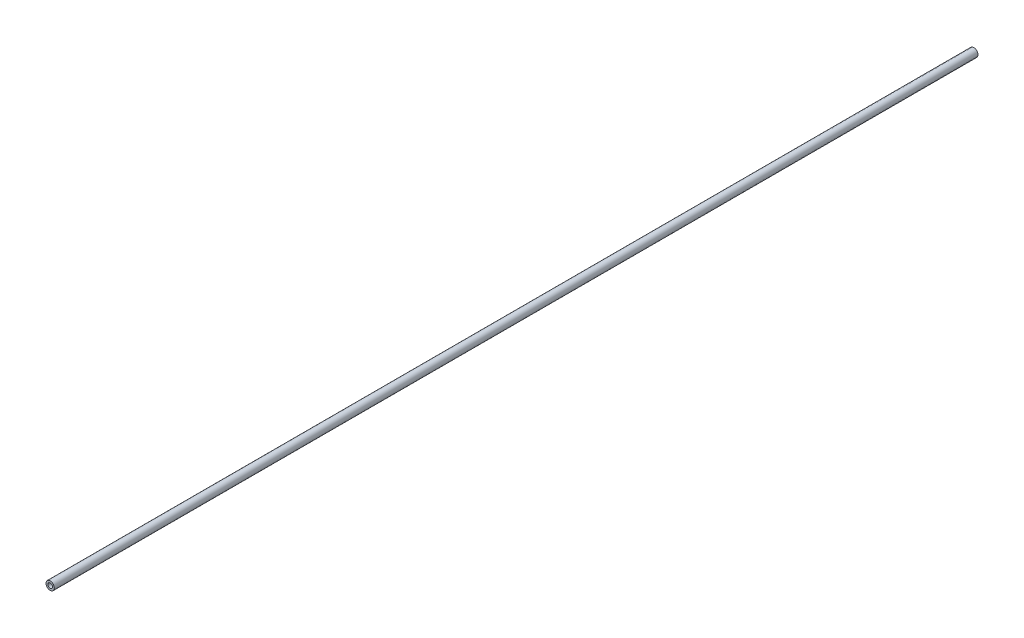
ISO-10303-21;
HEADER;
FILE_DESCRIPTION(('STEP AP214'),'2;1');
FILE_NAME('part.step','',(''),(''),'','','');
FILE_SCHEMA(('AUTOMOTIVE_DESIGN { 1 0 10303 214 1 1 1 1 }'));
ENDSEC;
DATA;
#1=APPLICATION_CONTEXT('core data for automotive mechanical design processes');
#2=APPLICATION_PROTOCOL_DEFINITION('international standard','automotive_design',2000,#1);
#3=PRODUCT_CONTEXT('',#1,'mechanical');
#4=PRODUCT('Part','Part','',(#3));
#5=PRODUCT_RELATED_PRODUCT_CATEGORY('part','',(#4));
#6=PRODUCT_DEFINITION_FORMATION('','',#4);
#7=PRODUCT_DEFINITION_CONTEXT('part definition',#1,'design');
#8=PRODUCT_DEFINITION('design','',#6,#7);
#9=PRODUCT_DEFINITION_SHAPE('','',#8);
#10=(LENGTH_UNIT() NAMED_UNIT(*) SI_UNIT(.MILLI.,.METRE.));
#11=(NAMED_UNIT(*) PLANE_ANGLE_UNIT() SI_UNIT($,.RADIAN.));
#12=(NAMED_UNIT(*) SI_UNIT($,.STERADIAN.) SOLID_ANGLE_UNIT());
#13=UNCERTAINTY_MEASURE_WITH_UNIT(LENGTH_MEASURE(1.E-05),#10,'distance_accuracy_value','');
#14=(GEOMETRIC_REPRESENTATION_CONTEXT(3) GLOBAL_UNCERTAINTY_ASSIGNED_CONTEXT((#13)) GLOBAL_UNIT_ASSIGNED_CONTEXT((#10,
#11,#12)) REPRESENTATION_CONTEXT('',''));
#15=CARTESIAN_POINT('',(0.,0.,0.));
#16=DIRECTION('',(0.,0.,1.));
#17=DIRECTION('',(1.,0.,0.));
#18=AXIS2_PLACEMENT_3D('',#15,#16,#17);
#19=CARTESIAN_POINT('',(0.,0.,762.));
#20=DIRECTION('',(0.,0.,1.));
#21=DIRECTION('',(1.,0.,0.));
#22=AXIS2_PLACEMENT_3D('',#19,#20,#21);
#23=PLANE('',#22);
#24=CARTESIAN_POINT('',(0.,0.,762.));
#25=DIRECTION('',(0.,0.,1.));
#26=DIRECTION('',(1.,0.,0.));
#27=AXIS2_PLACEMENT_3D('',#24,#25,#26);
#28=CIRCLE('',#27,6.858);
#29=CARTESIAN_POINT('',(6.858,0.,762.));
#30=VERTEX_POINT('',#29);
#31=EDGE_CURVE('E11',#30,#30,#28,.T.);
#32=ORIENTED_EDGE('',*,*,#31,.T.);
#33=EDGE_LOOP('',(#32));
#34=FACE_BOUND('',#33,.T.);
#35=CARTESIAN_POINT('',(0.,0.,762.));
#36=DIRECTION('',(0.,0.,1.));
#37=DIRECTION('',(1.,0.,0.));
#38=AXIS2_PLACEMENT_3D('',#35,#36,#37);
#39=CIRCLE('',#38,3.8354);
#40=CARTESIAN_POINT('',(3.8354,0.,762.));
#41=VERTEX_POINT('',#40);
#42=EDGE_CURVE('E46',#41,#41,#39,.T.);
#43=ORIENTED_EDGE('',*,*,#42,.F.);
#44=EDGE_LOOP('',(#43));
#45=FACE_BOUND('',#44,.T.);
#46=ADVANCED_FACE('F35',(#34,#45),#23,.T.);
#47=CARTESIAN_POINT('',(0.,0.,-762.));
#48=DIRECTION('',(0.,0.,1.));
#49=DIRECTION('',(1.,0.,0.));
#50=AXIS2_PLACEMENT_3D('',#47,#48,#49);
#51=PLANE('',#50);
#52=CARTESIAN_POINT('',(0.,0.,-762.));
#53=DIRECTION('',(0.,0.,1.));
#54=DIRECTION('',(1.,0.,0.));
#55=AXIS2_PLACEMENT_3D('',#52,#53,#54);
#56=CIRCLE('',#55,6.858);
#57=CARTESIAN_POINT('',(6.858,0.,-762.));
#58=VERTEX_POINT('',#57);
#59=EDGE_CURVE('E39',#58,#58,#56,.T.);
#60=ORIENTED_EDGE('',*,*,#59,.F.);
#61=EDGE_LOOP('',(#60));
#62=FACE_BOUND('',#61,.T.);
#63=CARTESIAN_POINT('',(0.,0.,-762.));
#64=DIRECTION('',(0.,0.,1.));
#65=DIRECTION('',(1.,0.,0.));
#66=AXIS2_PLACEMENT_3D('',#63,#64,#65);
#67=CIRCLE('',#66,3.8354);
#68=CARTESIAN_POINT('',(3.8354,0.,-762.));
#69=VERTEX_POINT('',#68);
#70=EDGE_CURVE('E48',#69,#69,#67,.T.);
#71=ORIENTED_EDGE('',*,*,#70,.T.);
#72=EDGE_LOOP('',(#71));
#73=FACE_BOUND('',#72,.T.);
#74=ADVANCED_FACE('F58',(#62,#73),#51,.F.);
#75=CARTESIAN_POINT('',(0.,0.,762.));
#76=DIRECTION('',(0.,0.,-1.));
#77=DIRECTION('',(-1.,0.,0.));
#78=AXIS2_PLACEMENT_3D('',#75,#76,#77);
#79=CYLINDRICAL_SURFACE('',#78,6.858);
#80=ORIENTED_EDGE('',*,*,#31,.F.);
#81=EDGE_LOOP('',(#80));
#82=FACE_BOUND('',#81,.T.);
#83=ORIENTED_EDGE('',*,*,#59,.T.);
#84=EDGE_LOOP('',(#83));
#85=FACE_BOUND('',#84,.T.);
#86=ADVANCED_FACE('F37',(#82,#85),#79,.T.);
#87=CARTESIAN_POINT('',(0.,0.,762.));
#88=DIRECTION('',(0.,0.,-1.));
#89=DIRECTION('',(-1.,0.,0.));
#90=AXIS2_PLACEMENT_3D('',#87,#88,#89);
#91=CYLINDRICAL_SURFACE('',#90,3.8354);
#92=ORIENTED_EDGE('',*,*,#42,.T.);
#93=EDGE_LOOP('',(#92));
#94=FACE_BOUND('',#93,.T.);
#95=ORIENTED_EDGE('',*,*,#70,.F.);
#96=EDGE_LOOP('',(#95));
#97=FACE_BOUND('',#96,.T.);
#98=ADVANCED_FACE('F54',(#94,#97),#91,.F.);
#99=CLOSED_SHELL('',(#46,#74,#86,#98));
#100=MANIFOLD_SOLID_BREP('B2',#99);
#101=ADVANCED_BREP_SHAPE_REPRESENTATION('',(#18,#100),#14);
#102=SHAPE_DEFINITION_REPRESENTATION(#9,#101);
ENDSEC;
END-ISO-10303-21;
